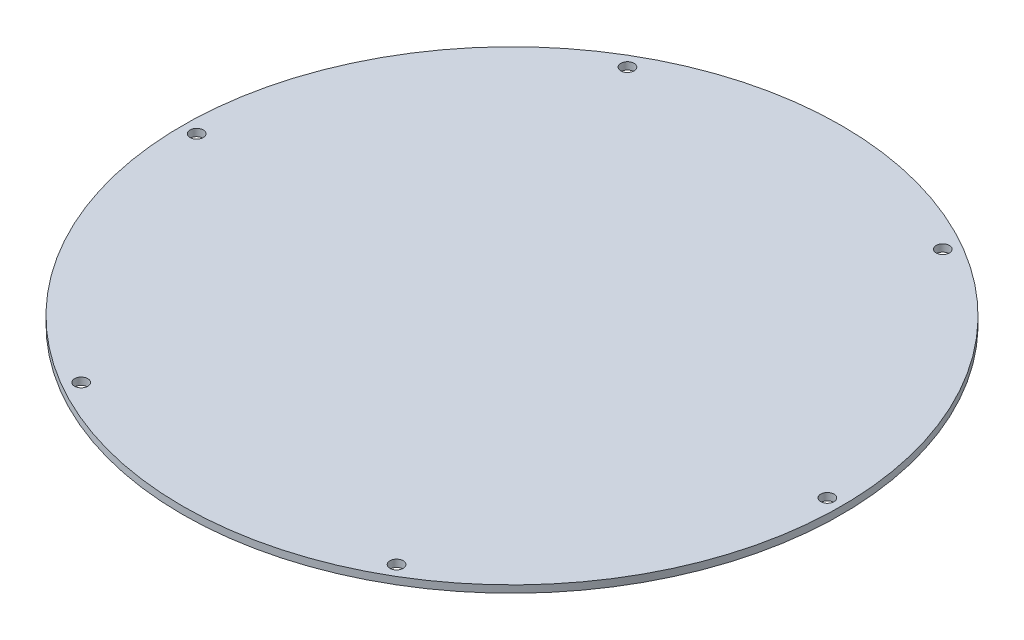
ISO-10303-21;
HEADER;
FILE_DESCRIPTION(('STEP AP214'),'2;1');
FILE_NAME('part.step','',(''),(''),'','','');
FILE_SCHEMA(('AUTOMOTIVE_DESIGN { 1 0 10303 214 1 1 1 1 }'));
ENDSEC;
DATA;
#1=APPLICATION_CONTEXT('core data for automotive mechanical design processes');
#2=APPLICATION_PROTOCOL_DEFINITION('international standard','automotive_design',2000,#1);
#3=PRODUCT_CONTEXT('',#1,'mechanical');
#4=PRODUCT('Part','Part','',(#3));
#5=PRODUCT_RELATED_PRODUCT_CATEGORY('part','',(#4));
#6=PRODUCT_DEFINITION_FORMATION('','',#4);
#7=PRODUCT_DEFINITION_CONTEXT('part definition',#1,'design');
#8=PRODUCT_DEFINITION('design','',#6,#7);
#9=PRODUCT_DEFINITION_SHAPE('','',#8);
#10=(LENGTH_UNIT() NAMED_UNIT(*) SI_UNIT(.MILLI.,.METRE.));
#11=(NAMED_UNIT(*) PLANE_ANGLE_UNIT() SI_UNIT($,.RADIAN.));
#12=(NAMED_UNIT(*) SI_UNIT($,.STERADIAN.) SOLID_ANGLE_UNIT());
#13=UNCERTAINTY_MEASURE_WITH_UNIT(LENGTH_MEASURE(1.E-05),#10,'distance_accuracy_value','');
#14=(GEOMETRIC_REPRESENTATION_CONTEXT(3) GLOBAL_UNCERTAINTY_ASSIGNED_CONTEXT((#13)) GLOBAL_UNIT_ASSIGNED_CONTEXT((#10,
#11,#12)) REPRESENTATION_CONTEXT('',''));
#15=CARTESIAN_POINT('',(0.,0.,0.));
#16=DIRECTION('',(0.,0.,1.));
#17=DIRECTION('',(1.,0.,0.));
#18=AXIS2_PLACEMENT_3D('',#15,#16,#17);
#19=CARTESIAN_POINT('',(0.,1.15,0.));
#20=DIRECTION('',(0.,-1.,0.));
#21=DIRECTION('',(0.,0.,-1.));
#22=AXIS2_PLACEMENT_3D('',#19,#20,#21);
#23=CYLINDRICAL_SURFACE('',#22,52.25);
#24=CARTESIAN_POINT('',(0.,1.15,0.));
#25=DIRECTION('',(0.,1.,0.));
#26=DIRECTION('',(0.,0.,1.));
#27=AXIS2_PLACEMENT_3D('',#24,#25,#26);
#28=CIRCLE('',#27,52.25);
#29=CARTESIAN_POINT('',(0.,1.15,52.25));
#30=VERTEX_POINT('',#29);
#31=EDGE_CURVE('E10',#30,#30,#28,.T.);
#32=ORIENTED_EDGE('',*,*,#31,.F.);
#33=EDGE_LOOP('',(#32));
#34=FACE_BOUND('',#33,.T.);
#35=CARTESIAN_POINT('',(0.,0.,0.));
#36=DIRECTION('',(0.,1.,0.));
#37=DIRECTION('',(0.,0.,1.));
#38=AXIS2_PLACEMENT_3D('',#35,#36,#37);
#39=CIRCLE('',#38,52.25);
#40=CARTESIAN_POINT('',(0.,0.,52.25));
#41=VERTEX_POINT('',#40);
#42=EDGE_CURVE('E43',#41,#41,#39,.T.);
#43=ORIENTED_EDGE('',*,*,#42,.T.);
#44=EDGE_LOOP('',(#43));
#45=FACE_BOUND('',#44,.T.);
#46=ADVANCED_FACE('F40',(#34,#45),#23,.T.);
#47=CARTESIAN_POINT('',(0.,1.15,0.));
#48=DIRECTION('',(0.,1.,0.));
#49=DIRECTION('',(0.,0.,1.));
#50=AXIS2_PLACEMENT_3D('',#47,#48,#49);
#51=PLANE('',#50);
#52=CARTESIAN_POINT('',(-50.,1.15,-3.49148133884313E-13));
#53=DIRECTION('',(0.,-1.,0.));
#54=DIRECTION('',(0.,0.,-1.));
#55=AXIS2_PLACEMENT_3D('',#52,#53,#54);
#56=CIRCLE('',#55,1.05);
#57=CARTESIAN_POINT('',(-50.,1.15,-1.05000000000035));
#58=VERTEX_POINT('',#57);
#59=EDGE_CURVE('E81',#58,#58,#56,.T.);
#60=ORIENTED_EDGE('',*,*,#59,.T.);
#61=EDGE_LOOP('',(#60));
#62=FACE_BOUND('',#61,.T.);
#63=CARTESIAN_POINT('',(-25.0000000000002,1.15,43.3012701892218));
#64=DIRECTION('',(0.,-1.,0.));
#65=DIRECTION('',(0.,0.,-1.));
#66=AXIS2_PLACEMENT_3D('',#63,#64,#65);
#67=CIRCLE('',#66,1.05);
#68=CARTESIAN_POINT('',(-25.0000000000002,1.15,42.2512701892218));
#69=VERTEX_POINT('',#68);
#70=EDGE_CURVE('E75',#69,#69,#67,.T.);
#71=ORIENTED_EDGE('',*,*,#70,.T.);
#72=EDGE_LOOP('',(#71));
#73=FACE_BOUND('',#72,.T.);
#74=CARTESIAN_POINT('',(24.9999999999999,1.15,43.301270189222));
#75=DIRECTION('',(0.,-1.,0.));
#76=DIRECTION('',(0.,0.,-1.));
#77=AXIS2_PLACEMENT_3D('',#74,#75,#76);
#78=CIRCLE('',#77,1.05);
#79=CARTESIAN_POINT('',(24.9999999999999,1.15,42.251270189222));
#80=VERTEX_POINT('',#79);
#81=EDGE_CURVE('E69',#80,#80,#78,.T.);
#82=ORIENTED_EDGE('',*,*,#81,.T.);
#83=EDGE_LOOP('',(#82));
#84=FACE_BOUND('',#83,.T.);
#85=CARTESIAN_POINT('',(50.,1.15,0.));
#86=DIRECTION('',(0.,-1.,0.));
#87=DIRECTION('',(0.,0.,-1.));
#88=AXIS2_PLACEMENT_3D('',#85,#86,#87);
#89=CIRCLE('',#88,1.05);
#90=CARTESIAN_POINT('',(50.,1.15,-1.05));
#91=VERTEX_POINT('',#90);
#92=EDGE_CURVE('E63',#91,#91,#89,.T.);
#93=ORIENTED_EDGE('',*,*,#92,.T.);
#94=EDGE_LOOP('',(#93));
#95=FACE_BOUND('',#94,.T.);
#96=CARTESIAN_POINT('',(25.0000000000005,1.15,-43.3012701892216));
#97=DIRECTION('',(0.,-1.,0.));
#98=DIRECTION('',(0.,0.,-1.));
#99=AXIS2_PLACEMENT_3D('',#96,#97,#98);
#100=CIRCLE('',#99,1.05);
#101=CARTESIAN_POINT('',(25.0000000000005,1.15,-44.3512701892216));
#102=VERTEX_POINT('',#101);
#103=EDGE_CURVE('E57',#102,#102,#100,.T.);
#104=ORIENTED_EDGE('',*,*,#103,.T.);
#105=EDGE_LOOP('',(#104));
#106=FACE_BOUND('',#105,.T.);
#107=CARTESIAN_POINT('',(-24.9999999999996,1.15,-43.3012701892222));
#108=DIRECTION('',(0.,-1.,0.));
#109=DIRECTION('',(0.,0.,-1.));
#110=AXIS2_PLACEMENT_3D('',#107,#108,#109);
#111=CIRCLE('',#110,1.05);
#112=CARTESIAN_POINT('',(-24.9999999999996,1.15,-44.3512701892222));
#113=VERTEX_POINT('',#112);
#114=EDGE_CURVE('E50',#113,#113,#111,.T.);
#115=ORIENTED_EDGE('',*,*,#114,.T.);
#116=EDGE_LOOP('',(#115));
#117=FACE_BOUND('',#116,.T.);
#118=ORIENTED_EDGE('',*,*,#31,.T.);
#119=EDGE_LOOP('',(#118));
#120=FACE_BOUND('',#119,.T.);
#121=ADVANCED_FACE('F94',(#62,#73,#84,#95,#106,#117,#120),#51,.T.);
#122=CARTESIAN_POINT('',(0.,0.,0.));
#123=DIRECTION('',(0.,1.,0.));
#124=DIRECTION('',(0.,0.,1.));
#125=AXIS2_PLACEMENT_3D('',#122,#123,#124);
#126=PLANE('',#125);
#127=CARTESIAN_POINT('',(-50.,0.,-3.49148133884313E-13));
#128=DIRECTION('',(0.,-1.,0.));
#129=DIRECTION('',(0.,0.,-1.));
#130=AXIS2_PLACEMENT_3D('',#127,#128,#129);
#131=CIRCLE('',#130,1.04999999999999);
#132=CARTESIAN_POINT('',(-50.,0.,-1.05000000000034));
#133=VERTEX_POINT('',#132);
#134=EDGE_CURVE('E84',#133,#133,#131,.T.);
#135=ORIENTED_EDGE('',*,*,#134,.F.);
#136=EDGE_LOOP('',(#135));
#137=FACE_BOUND('',#136,.T.);
#138=CARTESIAN_POINT('',(-25.0000000000002,0.,43.3012701892218));
#139=DIRECTION('',(0.,-1.,0.));
#140=DIRECTION('',(0.,0.,-1.));
#141=AXIS2_PLACEMENT_3D('',#138,#139,#140);
#142=CIRCLE('',#141,1.04999999999999);
#143=CARTESIAN_POINT('',(-25.0000000000002,0.,42.2512701892218));
#144=VERTEX_POINT('',#143);
#145=EDGE_CURVE('E78',#144,#144,#142,.T.);
#146=ORIENTED_EDGE('',*,*,#145,.F.);
#147=EDGE_LOOP('',(#146));
#148=FACE_BOUND('',#147,.T.);
#149=CARTESIAN_POINT('',(24.9999999999999,0.,43.301270189222));
#150=DIRECTION('',(0.,-1.,0.));
#151=DIRECTION('',(0.,0.,-1.));
#152=AXIS2_PLACEMENT_3D('',#149,#150,#151);
#153=CIRCLE('',#152,1.04999999999999);
#154=CARTESIAN_POINT('',(24.9999999999999,0.,42.251270189222));
#155=VERTEX_POINT('',#154);
#156=EDGE_CURVE('E72',#155,#155,#153,.T.);
#157=ORIENTED_EDGE('',*,*,#156,.F.);
#158=EDGE_LOOP('',(#157));
#159=FACE_BOUND('',#158,.T.);
#160=CARTESIAN_POINT('',(50.,0.,0.));
#161=DIRECTION('',(0.,-1.,0.));
#162=DIRECTION('',(0.,0.,-1.));
#163=AXIS2_PLACEMENT_3D('',#160,#161,#162);
#164=CIRCLE('',#163,1.04999999999999);
#165=CARTESIAN_POINT('',(50.,0.,-1.04999999999999));
#166=VERTEX_POINT('',#165);
#167=EDGE_CURVE('E66',#166,#166,#164,.T.);
#168=ORIENTED_EDGE('',*,*,#167,.F.);
#169=EDGE_LOOP('',(#168));
#170=FACE_BOUND('',#169,.T.);
#171=CARTESIAN_POINT('',(25.0000000000005,0.,-43.3012701892216));
#172=DIRECTION('',(0.,-1.,0.));
#173=DIRECTION('',(0.,0.,-1.));
#174=AXIS2_PLACEMENT_3D('',#171,#172,#173);
#175=CIRCLE('',#174,1.04999999999999);
#176=CARTESIAN_POINT('',(25.0000000000005,0.,-44.3512701892216));
#177=VERTEX_POINT('',#176);
#178=EDGE_CURVE('E60',#177,#177,#175,.T.);
#179=ORIENTED_EDGE('',*,*,#178,.F.);
#180=EDGE_LOOP('',(#179));
#181=FACE_BOUND('',#180,.T.);
#182=CARTESIAN_POINT('',(-24.9999999999996,0.,-43.3012701892222));
#183=DIRECTION('',(0.,-1.,0.));
#184=DIRECTION('',(0.,0.,-1.));
#185=AXIS2_PLACEMENT_3D('',#182,#183,#184);
#186=CIRCLE('',#185,1.04999999999999);
#187=CARTESIAN_POINT('',(-24.9999999999996,0.,-44.3512701892222));
#188=VERTEX_POINT('',#187);
#189=EDGE_CURVE('E54',#188,#188,#186,.T.);
#190=ORIENTED_EDGE('',*,*,#189,.F.);
#191=EDGE_LOOP('',(#190));
#192=FACE_BOUND('',#191,.T.);
#193=ORIENTED_EDGE('',*,*,#42,.F.);
#194=EDGE_LOOP('',(#193));
#195=FACE_BOUND('',#194,.T.);
#196=ADVANCED_FACE('F90',(#137,#148,#159,#170,#181,#192,#195),#126,.F.);
#197=CARTESIAN_POINT('',(-24.9999999999996,0.,-43.3012701892222));
#198=DIRECTION('',(0.,-1.,0.));
#199=DIRECTION('',(0.,0.,-1.));
#200=AXIS2_PLACEMENT_3D('',#197,#198,#199);
#201=CYLINDRICAL_SURFACE('',#200,1.04999999999999);
#202=ORIENTED_EDGE('',*,*,#114,.F.);
#203=EDGE_LOOP('',(#202));
#204=FACE_BOUND('',#203,.T.);
#205=ORIENTED_EDGE('',*,*,#189,.T.);
#206=EDGE_LOOP('',(#205));
#207=FACE_BOUND('',#206,.T.);
#208=ADVANCED_FACE('F93',(#204,#207),#201,.F.);
#209=CARTESIAN_POINT('',(25.0000000000005,0.,-43.3012701892216));
#210=DIRECTION('',(0.,-1.,0.));
#211=DIRECTION('',(0.,0.,-1.));
#212=AXIS2_PLACEMENT_3D('',#209,#210,#211);
#213=CYLINDRICAL_SURFACE('',#212,1.04999999999999);
#214=ORIENTED_EDGE('',*,*,#103,.F.);
#215=EDGE_LOOP('',(#214));
#216=FACE_BOUND('',#215,.T.);
#217=ORIENTED_EDGE('',*,*,#178,.T.);
#218=EDGE_LOOP('',(#217));
#219=FACE_BOUND('',#218,.T.);
#220=ADVANCED_FACE('F120',(#216,#219),#213,.F.);
#221=CARTESIAN_POINT('',(50.,0.,0.));
#222=DIRECTION('',(0.,-1.,0.));
#223=DIRECTION('',(0.,0.,-1.));
#224=AXIS2_PLACEMENT_3D('',#221,#222,#223);
#225=CYLINDRICAL_SURFACE('',#224,1.05);
#226=ORIENTED_EDGE('',*,*,#92,.F.);
#227=EDGE_LOOP('',(#226));
#228=FACE_BOUND('',#227,.T.);
#229=ORIENTED_EDGE('',*,*,#167,.T.);
#230=EDGE_LOOP('',(#229));
#231=FACE_BOUND('',#230,.T.);
#232=ADVANCED_FACE('F124',(#228,#231),#225,.F.);
#233=CARTESIAN_POINT('',(24.9999999999999,0.,43.301270189222));
#234=DIRECTION('',(0.,-1.,0.));
#235=DIRECTION('',(0.,0.,-1.));
#236=AXIS2_PLACEMENT_3D('',#233,#234,#235);
#237=CYLINDRICAL_SURFACE('',#236,1.04999999999999);
#238=ORIENTED_EDGE('',*,*,#81,.F.);
#239=EDGE_LOOP('',(#238));
#240=FACE_BOUND('',#239,.T.);
#241=ORIENTED_EDGE('',*,*,#156,.T.);
#242=EDGE_LOOP('',(#241));
#243=FACE_BOUND('',#242,.T.);
#244=ADVANCED_FACE('F128',(#240,#243),#237,.F.);
#245=CARTESIAN_POINT('',(-25.0000000000002,0.,43.3012701892218));
#246=DIRECTION('',(0.,-1.,0.));
#247=DIRECTION('',(0.,0.,-1.));
#248=AXIS2_PLACEMENT_3D('',#245,#246,#247);
#249=CYLINDRICAL_SURFACE('',#248,1.04999999999999);
#250=ORIENTED_EDGE('',*,*,#70,.F.);
#251=EDGE_LOOP('',(#250));
#252=FACE_BOUND('',#251,.T.);
#253=ORIENTED_EDGE('',*,*,#145,.T.);
#254=EDGE_LOOP('',(#253));
#255=FACE_BOUND('',#254,.T.);
#256=ADVANCED_FACE('F132',(#252,#255),#249,.F.);
#257=CARTESIAN_POINT('',(-50.,0.,-3.49148133884313E-13));
#258=DIRECTION('',(0.,-1.,0.));
#259=DIRECTION('',(0.,0.,-1.));
#260=AXIS2_PLACEMENT_3D('',#257,#258,#259);
#261=CYLINDRICAL_SURFACE('',#260,1.05);
#262=ORIENTED_EDGE('',*,*,#59,.F.);
#263=EDGE_LOOP('',(#262));
#264=FACE_BOUND('',#263,.T.);
#265=ORIENTED_EDGE('',*,*,#134,.T.);
#266=EDGE_LOOP('',(#265));
#267=FACE_BOUND('',#266,.T.);
#268=ADVANCED_FACE('F88',(#264,#267),#261,.F.);
#269=CLOSED_SHELL('',(#46,#121,#196,#208,#220,#232,#244,#256,#268));
#270=MANIFOLD_SOLID_BREP('B2',#269);
#271=ADVANCED_BREP_SHAPE_REPRESENTATION('',(#18,#270),#14);
#272=SHAPE_DEFINITION_REPRESENTATION(#9,#271);
ENDSEC;
END-ISO-10303-21;
